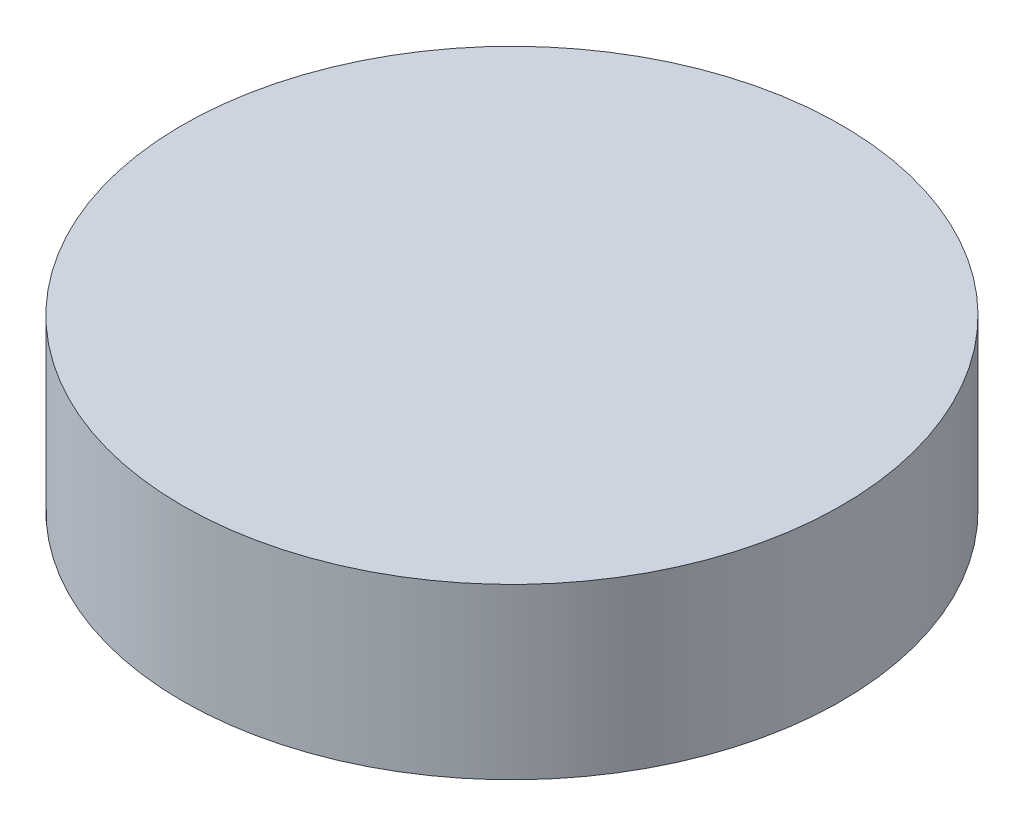
ISO-10303-21;
HEADER;
FILE_DESCRIPTION(('STEP AP214'),'2;1');
FILE_NAME('part.step','',(''),(''),'','','');
FILE_SCHEMA(('AUTOMOTIVE_DESIGN { 1 0 10303 214 1 1 1 1 }'));
ENDSEC;
DATA;
#1=APPLICATION_CONTEXT('core data for automotive mechanical design processes');
#2=APPLICATION_PROTOCOL_DEFINITION('international standard','automotive_design',2000,#1);
#3=PRODUCT_CONTEXT('',#1,'mechanical');
#4=PRODUCT('Part','Part','',(#3));
#5=PRODUCT_RELATED_PRODUCT_CATEGORY('part','',(#4));
#6=PRODUCT_DEFINITION_FORMATION('','',#4);
#7=PRODUCT_DEFINITION_CONTEXT('part definition',#1,'design');
#8=PRODUCT_DEFINITION('design','',#6,#7);
#9=PRODUCT_DEFINITION_SHAPE('','',#8);
#10=(LENGTH_UNIT() NAMED_UNIT(*) SI_UNIT(.MILLI.,.METRE.));
#11=(NAMED_UNIT(*) PLANE_ANGLE_UNIT() SI_UNIT($,.RADIAN.));
#12=(NAMED_UNIT(*) SI_UNIT($,.STERADIAN.) SOLID_ANGLE_UNIT());
#13=UNCERTAINTY_MEASURE_WITH_UNIT(LENGTH_MEASURE(1.E-05),#10,'distance_accuracy_value','');
#14=(GEOMETRIC_REPRESENTATION_CONTEXT(3) GLOBAL_UNCERTAINTY_ASSIGNED_CONTEXT((#13)) GLOBAL_UNIT_ASSIGNED_CONTEXT((#10,
#11,#12)) REPRESENTATION_CONTEXT('',''));
#15=CARTESIAN_POINT('',(0.,0.,0.));
#16=DIRECTION('',(0.,0.,1.));
#17=DIRECTION('',(1.,0.,0.));
#18=AXIS2_PLACEMENT_3D('',#15,#16,#17);
#19=CARTESIAN_POINT('',(0.,4.8,0.));
#20=DIRECTION('',(0.,-1.,0.));
#21=DIRECTION('',(0.,0.,-1.));
#22=AXIS2_PLACEMENT_3D('',#19,#20,#21);
#23=CYLINDRICAL_SURFACE('',#22,9.35);
#24=CARTESIAN_POINT('',(0.,4.8,0.));
#25=DIRECTION('',(0.,1.,0.));
#26=DIRECTION('',(0.,0.,1.));
#27=AXIS2_PLACEMENT_3D('',#24,#25,#26);
#28=CIRCLE('',#27,9.35);
#29=CARTESIAN_POINT('',(0.,4.8,9.35));
#30=VERTEX_POINT('',#29);
#31=EDGE_CURVE('E10',#30,#30,#28,.T.);
#32=ORIENTED_EDGE('',*,*,#31,.F.);
#33=EDGE_LOOP('',(#32));
#34=FACE_BOUND('',#33,.T.);
#35=CARTESIAN_POINT('',(0.,0.,0.));
#36=DIRECTION('',(0.,1.,0.));
#37=DIRECTION('',(0.,0.,1.));
#38=AXIS2_PLACEMENT_3D('',#35,#36,#37);
#39=CIRCLE('',#38,9.35);
#40=CARTESIAN_POINT('',(0.,0.,9.35));
#41=VERTEX_POINT('',#40);
#42=EDGE_CURVE('E37',#41,#41,#39,.T.);
#43=ORIENTED_EDGE('',*,*,#42,.T.);
#44=EDGE_LOOP('',(#43));
#45=FACE_BOUND('',#44,.T.);
#46=ADVANCED_FACE('F34',(#34,#45),#23,.T.);
#47=CARTESIAN_POINT('',(0.,4.8,0.));
#48=DIRECTION('',(0.,1.,0.));
#49=DIRECTION('',(0.,0.,1.));
#50=AXIS2_PLACEMENT_3D('',#47,#48,#49);
#51=PLANE('',#50);
#52=ORIENTED_EDGE('',*,*,#31,.T.);
#53=EDGE_LOOP('',(#52));
#54=FACE_BOUND('',#53,.T.);
#55=ADVANCED_FACE('F67',(#54),#51,.T.);
#56=CARTESIAN_POINT('',(0.,0.,0.));
#57=DIRECTION('',(0.,1.,0.));
#58=DIRECTION('',(0.,0.,1.));
#59=AXIS2_PLACEMENT_3D('',#56,#57,#58);
#60=PLANE('',#59);
#61=CARTESIAN_POINT('',(0.,0.,0.));
#62=DIRECTION('',(0.,1.,0.));
#63=DIRECTION('',(0.,0.,1.));
#64=AXIS2_PLACEMENT_3D('',#61,#62,#63);
#65=CIRCLE('',#64,8.1);
#66=CARTESIAN_POINT('',(0.,0.,8.1));
#67=VERTEX_POINT('',#66);
#68=EDGE_CURVE('E44',#67,#67,#65,.T.);
#69=ORIENTED_EDGE('',*,*,#68,.T.);
#70=EDGE_LOOP('',(#69));
#71=FACE_BOUND('',#70,.T.);
#72=ORIENTED_EDGE('',*,*,#42,.F.);
#73=EDGE_LOOP('',(#72));
#74=FACE_BOUND('',#73,.T.);
#75=ADVANCED_FACE('F52',(#71,#74),#60,.F.);
#76=CARTESIAN_POINT('',(0.,0.,0.));
#77=DIRECTION('',(0.,1.,0.));
#78=DIRECTION('',(0.,0.,1.));
#79=AXIS2_PLACEMENT_3D('',#76,#77,#78);
#80=CYLINDRICAL_SURFACE('',#79,8.1);
#81=ORIENTED_EDGE('',*,*,#68,.F.);
#82=EDGE_LOOP('',(#81));
#83=FACE_BOUND('',#82,.T.);
#84=CARTESIAN_POINT('',(0.,4.5,0.));
#85=DIRECTION('',(0.,1.,0.));
#86=DIRECTION('',(0.,0.,1.));
#87=AXIS2_PLACEMENT_3D('',#84,#85,#86);
#88=CIRCLE('',#87,8.1);
#89=CARTESIAN_POINT('',(0.,4.5,8.1));
#90=VERTEX_POINT('',#89);
#91=EDGE_CURVE('E46',#90,#90,#88,.T.);
#92=ORIENTED_EDGE('',*,*,#91,.T.);
#93=EDGE_LOOP('',(#92));
#94=FACE_BOUND('',#93,.T.);
#95=ADVANCED_FACE('F55',(#83,#94),#80,.F.);
#96=CARTESIAN_POINT('',(0.,4.5,0.));
#97=DIRECTION('',(0.,1.,0.));
#98=DIRECTION('',(0.,0.,1.));
#99=AXIS2_PLACEMENT_3D('',#96,#97,#98);
#100=PLANE('',#99);
#101=ORIENTED_EDGE('',*,*,#91,.F.);
#102=EDGE_LOOP('',(#101));
#103=FACE_BOUND('',#102,.T.);
#104=ADVANCED_FACE('F58',(#103),#100,.F.);
#105=CLOSED_SHELL('',(#46,#55,#75,#95,#104));
#106=MANIFOLD_SOLID_BREP('B2',#105);
#107=ADVANCED_BREP_SHAPE_REPRESENTATION('',(#18,#106),#14);
#108=SHAPE_DEFINITION_REPRESENTATION(#9,#107);
ENDSEC;
END-ISO-10303-21;
